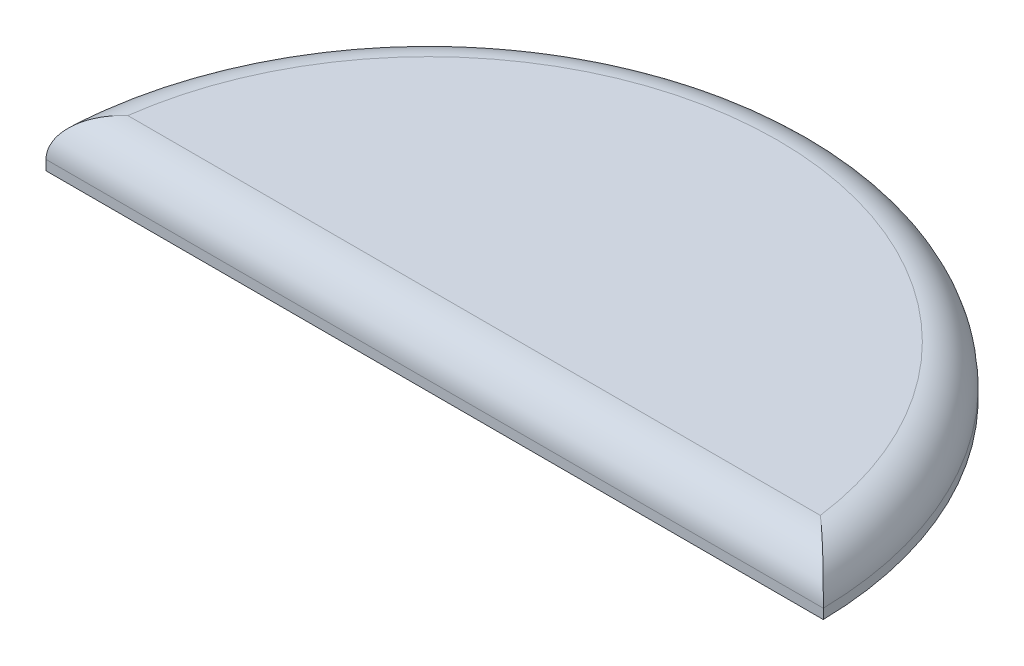
ISO-10303-21;
HEADER;
FILE_DESCRIPTION(('STEP AP214'),'2;1');
FILE_NAME('part.step','',(''),(''),'','','');
FILE_SCHEMA(('AUTOMOTIVE_DESIGN { 1 0 10303 214 1 1 1 1 }'));
ENDSEC;
DATA;
#1=APPLICATION_CONTEXT('core data for automotive mechanical design processes');
#2=APPLICATION_PROTOCOL_DEFINITION('international standard','automotive_design',2000,#1);
#3=PRODUCT_CONTEXT('',#1,'mechanical');
#4=PRODUCT('Part','Part','',(#3));
#5=PRODUCT_RELATED_PRODUCT_CATEGORY('part','',(#4));
#6=PRODUCT_DEFINITION_FORMATION('','',#4);
#7=PRODUCT_DEFINITION_CONTEXT('part definition',#1,'design');
#8=PRODUCT_DEFINITION('design','',#6,#7);
#9=PRODUCT_DEFINITION_SHAPE('','',#8);
#10=(LENGTH_UNIT() NAMED_UNIT(*) SI_UNIT(.MILLI.,.METRE.));
#11=(NAMED_UNIT(*) PLANE_ANGLE_UNIT() SI_UNIT($,.RADIAN.));
#12=(NAMED_UNIT(*) SI_UNIT($,.STERADIAN.) SOLID_ANGLE_UNIT());
#13=UNCERTAINTY_MEASURE_WITH_UNIT(LENGTH_MEASURE(1.E-05),#10,'distance_accuracy_value','');
#14=(GEOMETRIC_REPRESENTATION_CONTEXT(3) GLOBAL_UNCERTAINTY_ASSIGNED_CONTEXT((#13)) GLOBAL_UNIT_ASSIGNED_CONTEXT((#10,
#11,#12)) REPRESENTATION_CONTEXT('',''));
#15=CARTESIAN_POINT('',(0.,0.,0.));
#16=DIRECTION('',(0.,0.,1.));
#17=DIRECTION('',(1.,0.,0.));
#18=AXIS2_PLACEMENT_3D('',#15,#16,#17);
#19=CARTESIAN_POINT('',(-2.57054347826088,5.,0.627833576674897));
#20=DIRECTION('',(0.,-1.,0.));
#21=DIRECTION('',(0.,0.,-1.));
#22=AXIS2_PLACEMENT_3D('',#19,#20,#21);
#23=CYLINDRICAL_SURFACE('',#22,39.42);
#24=DIRECTION('',(0.,-1.,0.));
#25=VECTOR('',#24,1.);
#26=CARTESIAN_POINT('',(-41.9855434782609,5.,0.));
#27=LINE('',#26,#25);
#28=CARTESIAN_POINT('',(-41.9855434782609,1.,0.));
#29=VERTEX_POINT('',#28);
#30=CARTESIAN_POINT('',(-41.9855434782609,0.,0.));
#31=VERTEX_POINT('',#30);
#32=EDGE_CURVE('E81',#29,#31,#27,.T.);
#33=ORIENTED_EDGE('',*,*,#32,.F.);
#34=CARTESIAN_POINT('',(-2.57054347826088,1.,0.627833576674897));
#35=DIRECTION('',(0.,-1.,0.));
#36=DIRECTION('',(0.,0.,-1.));
#37=AXIS2_PLACEMENT_3D('',#34,#35,#36);
#38=CIRCLE('',#37,39.42);
#39=CARTESIAN_POINT('',(36.8444565217391,1.,0.));
#40=VERTEX_POINT('',#39);
#41=EDGE_CURVE('E11',#29,#40,#38,.T.);
#42=ORIENTED_EDGE('',*,*,#41,.T.);
#43=DIRECTION('',(0.,-1.,0.));
#44=VECTOR('',#43,1.);
#45=CARTESIAN_POINT('',(36.8444565217391,5.,0.));
#46=LINE('',#45,#44);
#47=CARTESIAN_POINT('',(36.8444565217391,0.,0.));
#48=VERTEX_POINT('',#47);
#49=EDGE_CURVE('E89',#40,#48,#46,.T.);
#50=ORIENTED_EDGE('',*,*,#49,.T.);
#51=CARTESIAN_POINT('',(-2.57054347826088,0.,0.627833576674897));
#52=DIRECTION('',(0.,1.,0.));
#53=DIRECTION('',(0.,0.,-1.));
#54=AXIS2_PLACEMENT_3D('',#51,#52,#53);
#55=CIRCLE('',#54,39.42);
#56=EDGE_CURVE('E93',#48,#31,#55,.T.);
#57=ORIENTED_EDGE('',*,*,#56,.T.);
#58=EDGE_LOOP('',(#33,#42,#50,#57));
#59=FACE_BOUND('',#58,.T.);
#60=ADVANCED_FACE('F39',(#59),#23,.T.);
#61=CARTESIAN_POINT('',(-41.9855434782609,5.,0.));
#62=DIRECTION('',(0.,0.,-1.));
#63=DIRECTION('',(-1.,0.,0.));
#64=AXIS2_PLACEMENT_3D('',#61,#62,#63);
#65=PLANE('',#64);
#66=ORIENTED_EDGE('',*,*,#49,.F.);
#67=DIRECTION('',(1.,0.,0.));
#68=VECTOR('',#67,1.);
#69=CARTESIAN_POINT('',(-41.9855434782609,1.,0.));
#70=LINE('',#69,#68);
#71=EDGE_CURVE('E54',#40,#29,#70,.F.);
#72=ORIENTED_EDGE('',*,*,#71,.T.);
#73=ORIENTED_EDGE('',*,*,#32,.T.);
#74=DIRECTION('',(1.,0.,0.));
#75=VECTOR('',#74,1.);
#76=CARTESIAN_POINT('',(-41.9855434782609,0.,0.));
#77=LINE('',#76,#75);
#78=EDGE_CURVE('E84',#31,#48,#77,.T.);
#79=ORIENTED_EDGE('',*,*,#78,.T.);
#80=EDGE_LOOP('',(#66,#72,#73,#79));
#81=FACE_BOUND('',#80,.T.);
#82=ADVANCED_FACE('F83',(#81),#65,.F.);
#83=CARTESIAN_POINT('',(-2.57054347826088,5.,0.627833576674897));
#84=DIRECTION('',(0.,-1.,0.));
#85=DIRECTION('',(0.,0.,-1.));
#86=AXIS2_PLACEMENT_3D('',#83,#84,#85);
#87=PLANE('',#86);
#88=CARTESIAN_POINT('',(-2.57054347826088,5.,0.627833576674897));
#89=DIRECTION('',(0.,-1.,0.));
#90=DIRECTION('',(0.,0.,-1.));
#91=AXIS2_PLACEMENT_3D('',#88,#89,#90);
#92=CIRCLE('',#91,35.42);
#93=CARTESIAN_POINT('',(32.5458281507472,5.,-4.));
#94=VERTEX_POINT('',#93);
#95=CARTESIAN_POINT('',(-37.6869151072689,5.,-4.));
#96=VERTEX_POINT('',#95);
#97=EDGE_CURVE('E88',#94,#96,#92,.F.);
#98=ORIENTED_EDGE('',*,*,#97,.T.);
#99=DIRECTION('',(1.,0.,0.));
#100=VECTOR('',#99,1.);
#101=CARTESIAN_POINT('',(-2.57054347826088,5.,-4.));
#102=LINE('',#101,#100);
#103=EDGE_CURVE('E105',#96,#94,#102,.T.);
#104=ORIENTED_EDGE('',*,*,#103,.T.);
#105=EDGE_LOOP('',(#98,#104));
#106=FACE_BOUND('',#105,.T.);
#107=ADVANCED_FACE('F124',(#106),#87,.F.);
#108=CARTESIAN_POINT('',(-2.57054347826088,0.,0.627833576674897));
#109=DIRECTION('',(0.,-1.,0.));
#110=DIRECTION('',(0.,0.,-1.));
#111=AXIS2_PLACEMENT_3D('',#108,#109,#110);
#112=PLANE('',#111);
#113=ORIENTED_EDGE('',*,*,#56,.F.);
#114=ORIENTED_EDGE('',*,*,#78,.F.);
#115=EDGE_LOOP('',(#113,#114));
#116=FACE_BOUND('',#115,.T.);
#117=ADVANCED_FACE('F92',(#116),#112,.T.);
#118=CARTESIAN_POINT('',(-2.57054347826088,1.,0.627833576674897));
#119=DIRECTION('',(0.,-1.,0.));
#120=DIRECTION('',(0.,0.,-1.));
#121=AXIS2_PLACEMENT_3D('',#118,#119,#120);
#122=TOROIDAL_SURFACE('',#121,35.42,4.);
#123=CARTESIAN_POINT('',(36.8444565217391,1.,0.));
#124=CARTESIAN_POINT('',(36.8444776756449,1.08888588215751,2.22020773679527E-05));
#125=CARTESIAN_POINT('',(36.8414469272564,1.17775517935006,-0.00296200791042348));
#126=CARTESIAN_POINT('',(36.8294446865583,1.35463529825626,-0.0147726209273998));
#127=CARTESIAN_POINT('',(36.8204777008445,1.44264671984876,-0.0235945921183515));
#128=CARTESIAN_POINT('',(36.7968648578222,1.61639249270471,-0.0468129645896687));
#129=CARTESIAN_POINT('',(36.7822671748028,1.70213973916039,-0.0611620761711133));
#130=CARTESIAN_POINT('',(36.747685785551,1.87146146874709,-0.0951283905867414));
#131=CARTESIAN_POINT('',(36.7277013444524,1.95503565372028,-0.114746312195254));
#132=CARTESIAN_POINT('',(36.6602971506176,2.20117745052259,-0.180851109459483));
#133=CARTESIAN_POINT('',(36.6053350252737,2.35981099469068,-0.234679308253594));
#134=CARTESIAN_POINT('',(36.4784654754323,2.66347769420617,-0.358585506482509));
#135=CARTESIAN_POINT('',(36.4065208826963,2.80848002855725,-0.428699143156164));
#136=CARTESIAN_POINT('',(36.2171564833145,3.13877671541929,-0.612626186710684));
#137=CARTESIAN_POINT('',(36.0930894806456,3.31679054058275,-0.732668773121887));
#138=CARTESIAN_POINT('',(35.8253510722893,3.64288349324596,-0.990259132398863));
#139=CARTESIAN_POINT('',(35.6816433027162,3.79090580051556,-1.12783934271547));
#140=CARTESIAN_POINT('',(35.4242376128942,4.01939736873095,-1.37273705113573));
#141=CARTESIAN_POINT('',(35.3139929261634,4.10698406025862,-1.477194981392));
#142=CARTESIAN_POINT('',(35.0878602299619,4.268639487791,-1.69047386492499));
#143=CARTESIAN_POINT('',(34.9719698100868,4.34270238468861,-1.79929667819106));
#144=CARTESIAN_POINT('',(34.7356357140981,4.47807230636684,-2.02014921503621));
#145=CARTESIAN_POINT('',(34.6151869996519,4.53936469852958,-2.13218245184707));
#146=CARTESIAN_POINT('',(34.3708188212883,4.64976442492757,-2.35834145488695));
#147=CARTESIAN_POINT('',(34.2468998699412,4.69887354823459,-2.47246691123425));
#148=CARTESIAN_POINT('',(33.8684119448791,4.82979756118002,-2.81923692149045));
#149=CARTESIAN_POINT('',(33.6095321377028,4.89386433421835,-3.05400964696741));
#150=CARTESIAN_POINT('',(33.0859160548457,4.97867628086439,-3.52363153729024));
#151=CARTESIAN_POINT('',(32.8211918515983,4.99950360090174,-3.75847970787213));
#152=CARTESIAN_POINT('',(32.552195714849,4.99999707020836,-3.99441615535713));
#153=CARTESIAN_POINT('',(32.5490120090733,4.99999999284361,-3.99720820157859));
#154=CARTESIAN_POINT('',(32.5458281507472,5.,-4.));
#155=B_SPLINE_CURVE_WITH_KNOTS('',3,(#123,#124,#125,#126,#127,#128,#129,#130,#131,#132,#133,
#134,#135,#136,#137,#138,#139,#140,#141,#142,#143,#144,#145,#146,#147,#148,#149,#150,#151,#152,
#153,#154),.UNSPECIFIED.,.F.,.F.,(4,2,2,2,2,2,2,2,2,2,2,2,2,2,2,4),(0.,0.266528925540407,
0.532855742776762,0.796952767881613,1.06108583958295,1.58740067898606,2.11487828242875,
2.85471240379061,3.59593533007281,4.12123062528806,4.64675219131453,5.17287263526998,
5.69891577442779,6.761638793767,7.82234099459602,7.83504467490264),.UNSPECIFIED.);
#156=EDGE_CURVE('E99',#40,#94,#155,.T.);
#157=ORIENTED_EDGE('',*,*,#156,.F.);
#158=ORIENTED_EDGE('',*,*,#41,.F.);
#159=CARTESIAN_POINT('',(-41.9855434782609,1.,0.));
#160=CARTESIAN_POINT('',(-41.9855646321667,1.08888588215751,2.22020773678678E-05));
#161=CARTESIAN_POINT('',(-41.9825338837782,1.17775517935006,-0.00296200791042357));
#162=CARTESIAN_POINT('',(-41.9705316430801,1.35463529825626,-0.0147726209273998));
#163=CARTESIAN_POINT('',(-41.9615646573663,1.44264671984876,-0.0235945921183516));
#164=CARTESIAN_POINT('',(-41.937951814344,1.61639249270471,-0.0468129645896687));
#165=CARTESIAN_POINT('',(-41.9233541313245,1.70213973916039,-0.0611620761711133));
#166=CARTESIAN_POINT('',(-41.8887727420727,1.87146146874709,-0.0951283905867414));
#167=CARTESIAN_POINT('',(-41.8687883009742,1.95503565372028,-0.114746312195254));
#168=CARTESIAN_POINT('',(-41.8013841071393,2.20117745052259,-0.180851109459483));
#169=CARTESIAN_POINT('',(-41.7464219817955,2.35981099469068,-0.234679308253594));
#170=CARTESIAN_POINT('',(-41.619552431954,2.66347769420617,-0.358585506482509));
#171=CARTESIAN_POINT('',(-41.547607839218,2.80848002855725,-0.428699143156164));
#172=CARTESIAN_POINT('',(-41.3582434398363,3.13877671541929,-0.612626186710684));
#173=CARTESIAN_POINT('',(-41.2341764371673,3.31679054058275,-0.732668773121887));
#174=CARTESIAN_POINT('',(-40.966438028811,3.64288349324596,-0.990259132398864));
#175=CARTESIAN_POINT('',(-40.822730259238,3.79090580051556,-1.12783934271547));
#176=CARTESIAN_POINT('',(-40.565324569416,4.01939736873095,-1.37273705113573));
#177=CARTESIAN_POINT('',(-40.4550798826852,4.10698406025862,-1.477194981392));
#178=CARTESIAN_POINT('',(-40.2289471864837,4.268639487791,-1.69047386492499));
#179=CARTESIAN_POINT('',(-40.1130567666085,4.34270238468861,-1.79929667819106));
#180=CARTESIAN_POINT('',(-39.8767226706199,4.47807230636684,-2.02014921503621));
#181=CARTESIAN_POINT('',(-39.7562739561737,4.53936469852958,-2.13218245184707));
#182=CARTESIAN_POINT('',(-39.51190577781,4.64976442492757,-2.35834145488695));
#183=CARTESIAN_POINT('',(-39.3879868264629,4.69887354823459,-2.47246691123425));
#184=CARTESIAN_POINT('',(-39.0094989014008,4.82979756118002,-2.81923692149045));
#185=CARTESIAN_POINT('',(-38.7506190942246,4.89386433421835,-3.05400964696742));
#186=CARTESIAN_POINT('',(-38.2270030113675,4.97867628086439,-3.52363153729024));
#187=CARTESIAN_POINT('',(-37.9622788081201,4.99950360090174,-3.75847970787213));
#188=CARTESIAN_POINT('',(-37.6932826713707,4.99999707020836,-3.99441615535713));
#189=CARTESIAN_POINT('',(-37.690098965595,4.99999999284361,-3.99720820157859));
#190=CARTESIAN_POINT('',(-37.6869151072689,5.,-4.));
#191=B_SPLINE_CURVE_WITH_KNOTS('',3,(#159,#160,#161,#162,#163,#164,#165,#166,#167,#168,#169,
#170,#171,#172,#173,#174,#175,#176,#177,#178,#179,#180,#181,#182,#183,#184,#185,#186,#187,#188,
#189,#190),.UNSPECIFIED.,.F.,.F.,(4,2,2,2,2,2,2,2,2,2,2,2,2,2,2,4),(0.,0.266528925540407,
0.532855742776762,0.796952767881613,1.06108583958295,1.58740067898606,2.11487828242875,
2.85471240379061,3.59593533007281,4.12123062528806,4.64675219131453,5.17287263526998,
5.69891577442778,6.76163879376699,7.82234099459602,7.83504467490263),.UNSPECIFIED.);
#192=EDGE_CURVE('E44',#96,#29,#191,.F.);
#193=ORIENTED_EDGE('',*,*,#192,.F.);
#194=ORIENTED_EDGE('',*,*,#97,.F.);
#195=EDGE_LOOP('',(#157,#158,#193,#194));
#196=FACE_BOUND('',#195,.T.);
#197=ADVANCED_FACE('F41',(#196),#122,.T.);
#198=CARTESIAN_POINT('',(-2.57054347826088,1.,-4.));
#199=DIRECTION('',(1.,0.,0.));
#200=DIRECTION('',(0.,0.,-1.));
#201=AXIS2_PLACEMENT_3D('',#198,#199,#200);
#202=CYLINDRICAL_SURFACE('',#201,4.);
#203=ORIENTED_EDGE('',*,*,#192,.T.);
#204=ORIENTED_EDGE('',*,*,#71,.F.);
#205=ORIENTED_EDGE('',*,*,#156,.T.);
#206=ORIENTED_EDGE('',*,*,#103,.F.);
#207=EDGE_LOOP('',(#203,#204,#205,#206));
#208=FACE_BOUND('',#207,.T.);
#209=ADVANCED_FACE('F115',(#208),#202,.T.);
#210=CLOSED_SHELL('',(#60,#82,#107,#117,#197,#209));
#211=MANIFOLD_SOLID_BREP('B2',#210);
#212=ADVANCED_BREP_SHAPE_REPRESENTATION('',(#18,#211),#14);
#213=SHAPE_DEFINITION_REPRESENTATION(#9,#212);
ENDSEC;
END-ISO-10303-21;
